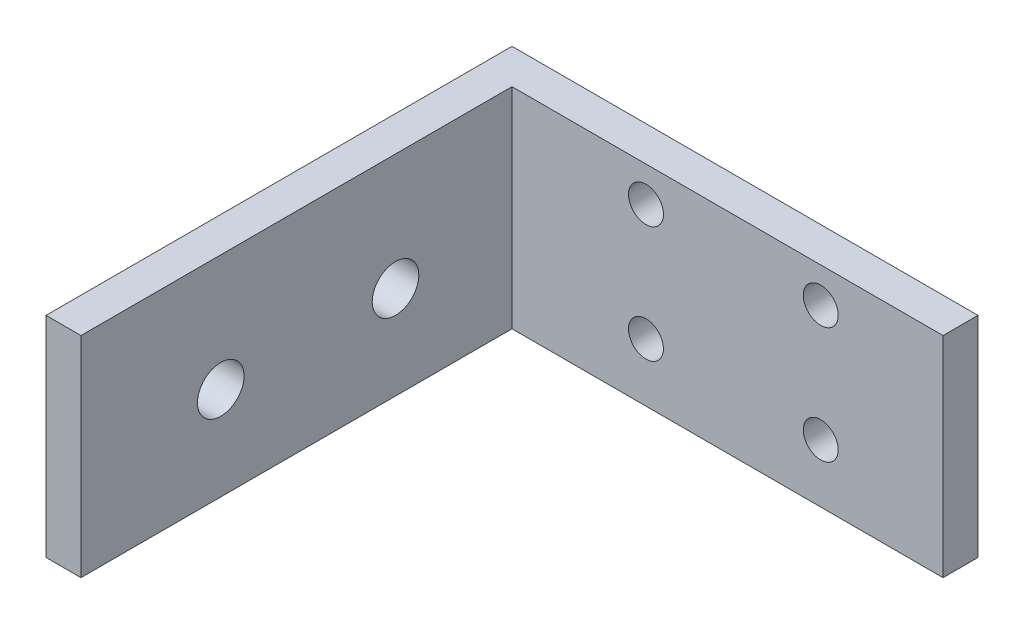
ISO-10303-21;
HEADER;
FILE_DESCRIPTION(('STEP AP214'),'2;1');
FILE_NAME('part.step','',(''),(''),'','','');
FILE_SCHEMA(('AUTOMOTIVE_DESIGN { 1 0 10303 214 1 1 1 1 }'));
ENDSEC;
DATA;
#1=APPLICATION_CONTEXT('core data for automotive mechanical design processes');
#2=APPLICATION_PROTOCOL_DEFINITION('international standard','automotive_design',2000,#1);
#3=PRODUCT_CONTEXT('',#1,'mechanical');
#4=PRODUCT('Part','Part','',(#3));
#5=PRODUCT_RELATED_PRODUCT_CATEGORY('part','',(#4));
#6=PRODUCT_DEFINITION_FORMATION('','',#4);
#7=PRODUCT_DEFINITION_CONTEXT('part definition',#1,'design');
#8=PRODUCT_DEFINITION('design','',#6,#7);
#9=PRODUCT_DEFINITION_SHAPE('','',#8);
#10=(LENGTH_UNIT() NAMED_UNIT(*) SI_UNIT(.MILLI.,.METRE.));
#11=(NAMED_UNIT(*) PLANE_ANGLE_UNIT() SI_UNIT($,.RADIAN.));
#12=(NAMED_UNIT(*) SI_UNIT($,.STERADIAN.) SOLID_ANGLE_UNIT());
#13=UNCERTAINTY_MEASURE_WITH_UNIT(LENGTH_MEASURE(1.E-05),#10,'distance_accuracy_value','');
#14=(GEOMETRIC_REPRESENTATION_CONTEXT(3) GLOBAL_UNCERTAINTY_ASSIGNED_CONTEXT((#13)) GLOBAL_UNIT_ASSIGNED_CONTEXT((#10,
#11,#12)) REPRESENTATION_CONTEXT('',''));
#15=CARTESIAN_POINT('',(0.,0.,0.));
#16=DIRECTION('',(0.,0.,1.));
#17=DIRECTION('',(1.,0.,0.));
#18=AXIS2_PLACEMENT_3D('',#15,#16,#17);
#19=CARTESIAN_POINT('',(0.,0.,3.));
#20=DIRECTION('',(0.,0.,-1.));
#21=DIRECTION('',(-1.,0.,0.));
#22=AXIS2_PLACEMENT_3D('',#19,#20,#21);
#23=PLANE('',#22);
#24=CARTESIAN_POINT('',(29.5,15.,3.));
#25=DIRECTION('',(0.,0.,1.));
#26=DIRECTION('',(1.,0.,0.));
#27=AXIS2_PLACEMENT_3D('',#24,#25,#26);
#28=CIRCLE('',#27,1.5);
#29=CARTESIAN_POINT('',(31.,15.,3.));
#30=VERTEX_POINT('',#29);
#31=EDGE_CURVE('E302',#30,#30,#28,.T.);
#32=ORIENTED_EDGE('',*,*,#31,.F.);
#33=EDGE_LOOP('',(#32));
#34=FACE_BOUND('',#33,.T.);
#35=CARTESIAN_POINT('',(14.5,5.,3.));
#36=DIRECTION('',(0.,0.,1.));
#37=DIRECTION('',(1.,0.,0.));
#38=AXIS2_PLACEMENT_3D('',#35,#36,#37);
#39=CIRCLE('',#38,1.5);
#40=CARTESIAN_POINT('',(16.,5.,3.));
#41=VERTEX_POINT('',#40);
#42=EDGE_CURVE('E308',#41,#41,#39,.T.);
#43=ORIENTED_EDGE('',*,*,#42,.F.);
#44=EDGE_LOOP('',(#43));
#45=FACE_BOUND('',#44,.T.);
#46=CARTESIAN_POINT('',(29.5,5.,3.));
#47=DIRECTION('',(0.,0.,1.));
#48=DIRECTION('',(1.,0.,0.));
#49=AXIS2_PLACEMENT_3D('',#46,#47,#48);
#50=CIRCLE('',#49,1.5);
#51=CARTESIAN_POINT('',(31.,5.,3.));
#52=VERTEX_POINT('',#51);
#53=EDGE_CURVE('E295',#52,#52,#50,.T.);
#54=ORIENTED_EDGE('',*,*,#53,.F.);
#55=EDGE_LOOP('',(#54));
#56=FACE_BOUND('',#55,.T.);
#57=CARTESIAN_POINT('',(14.5,15.,3.));
#58=DIRECTION('',(0.,0.,1.));
#59=DIRECTION('',(1.,0.,0.));
#60=AXIS2_PLACEMENT_3D('',#57,#58,#59);
#61=CIRCLE('',#60,1.5);
#62=CARTESIAN_POINT('',(16.,15.,3.));
#63=VERTEX_POINT('',#62);
#64=EDGE_CURVE('E301',#63,#63,#61,.T.);
#65=ORIENTED_EDGE('',*,*,#64,.F.);
#66=EDGE_LOOP('',(#65));
#67=FACE_BOUND('',#66,.T.);
#68=DIRECTION('',(0.,1.,0.));
#69=VECTOR('',#68,1.);
#70=CARTESIAN_POINT('',(3.,18.,3.));
#71=LINE('',#70,#69);
#72=CARTESIAN_POINT('',(3.,0.,3.));
#73=VERTEX_POINT('',#72);
#74=CARTESIAN_POINT('',(3.,18.,3.));
#75=VERTEX_POINT('',#74);
#76=EDGE_CURVE('E48',#73,#75,#71,.T.);
#77=ORIENTED_EDGE('',*,*,#76,.F.);
#78=DIRECTION('',(1.,0.,0.));
#79=VECTOR('',#78,1.);
#80=CARTESIAN_POINT('',(0.,0.,3.));
#81=LINE('',#80,#79);
#82=CARTESIAN_POINT('',(40.,0.,3.));
#83=VERTEX_POINT('',#82);
#84=EDGE_CURVE('E85',#73,#83,#81,.T.);
#85=ORIENTED_EDGE('',*,*,#84,.T.);
#86=DIRECTION('',(0.,1.,0.));
#87=VECTOR('',#86,1.);
#88=CARTESIAN_POINT('',(40.,0.,3.));
#89=LINE('',#88,#87);
#90=CARTESIAN_POINT('',(40.,18.,3.));
#91=VERTEX_POINT('',#90);
#92=EDGE_CURVE('E54',#83,#91,#89,.T.);
#93=ORIENTED_EDGE('',*,*,#92,.T.);
#94=DIRECTION('',(-1.,0.,0.));
#95=VECTOR('',#94,1.);
#96=CARTESIAN_POINT('',(0.,18.,3.));
#97=LINE('',#96,#95);
#98=EDGE_CURVE('E95',#91,#75,#97,.T.);
#99=ORIENTED_EDGE('',*,*,#98,.T.);
#100=EDGE_LOOP('',(#77,#85,#93,#99));
#101=FACE_BOUND('',#100,.T.);
#102=ADVANCED_FACE('F33',(#34,#45,#56,#67,#101),#23,.F.);
#103=CARTESIAN_POINT('',(0.,0.,3.));
#104=DIRECTION('',(1.,0.,0.));
#105=DIRECTION('',(0.,0.,-1.));
#106=AXIS2_PLACEMENT_3D('',#103,#104,#105);
#107=PLANE('',#106);
#108=CARTESIAN_POINT('',(0.,8.,13.));
#109=DIRECTION('',(1.,0.,0.));
#110=DIRECTION('',(0.,1.,0.));
#111=AXIS2_PLACEMENT_3D('',#108,#109,#110);
#112=CIRCLE('',#111,2.);
#113=CARTESIAN_POINT('',(0.,10.,13.));
#114=VERTEX_POINT('',#113);
#115=EDGE_CURVE('E284',#114,#114,#112,.T.);
#116=ORIENTED_EDGE('',*,*,#115,.T.);
#117=EDGE_LOOP('',(#116));
#118=FACE_BOUND('',#117,.T.);
#119=CARTESIAN_POINT('',(0.,8.,28.));
#120=DIRECTION('',(1.,0.,0.));
#121=DIRECTION('',(0.,1.,0.));
#122=AXIS2_PLACEMENT_3D('',#119,#120,#121);
#123=CIRCLE('',#122,2.);
#124=CARTESIAN_POINT('',(0.,10.,28.));
#125=VERTEX_POINT('',#124);
#126=EDGE_CURVE('E292',#125,#125,#123,.T.);
#127=ORIENTED_EDGE('',*,*,#126,.T.);
#128=EDGE_LOOP('',(#127));
#129=FACE_BOUND('',#128,.T.);
#130=DIRECTION('',(0.,-1.,0.));
#131=VECTOR('',#130,1.);
#132=CARTESIAN_POINT('',(0.,0.,0.));
#133=LINE('',#132,#131);
#134=CARTESIAN_POINT('',(0.,18.,0.));
#135=VERTEX_POINT('',#134);
#136=CARTESIAN_POINT('',(0.,0.,0.));
#137=VERTEX_POINT('',#136);
#138=EDGE_CURVE('E92',#135,#137,#133,.T.);
#139=ORIENTED_EDGE('',*,*,#138,.T.);
#140=DIRECTION('',(0.,0.,-1.));
#141=VECTOR('',#140,1.);
#142=CARTESIAN_POINT('',(0.,0.,3.));
#143=LINE('',#142,#141);
#144=CARTESIAN_POINT('',(0.,0.,40.));
#145=VERTEX_POINT('',#144);
#146=EDGE_CURVE('E11',#145,#137,#143,.T.);
#147=ORIENTED_EDGE('',*,*,#146,.F.);
#148=DIRECTION('',(0.,-1.,0.));
#149=VECTOR('',#148,1.);
#150=CARTESIAN_POINT('',(0.,18.,40.));
#151=LINE('',#150,#149);
#152=CARTESIAN_POINT('',(0.,18.,40.));
#153=VERTEX_POINT('',#152);
#154=EDGE_CURVE('E94',#153,#145,#151,.T.);
#155=ORIENTED_EDGE('',*,*,#154,.F.);
#156=DIRECTION('',(0.,0.,-1.));
#157=VECTOR('',#156,1.);
#158=CARTESIAN_POINT('',(0.,18.,3.));
#159=LINE('',#158,#157);
#160=EDGE_CURVE('E78',#153,#135,#159,.T.);
#161=ORIENTED_EDGE('',*,*,#160,.T.);
#162=EDGE_LOOP('',(#139,#147,#155,#161));
#163=FACE_BOUND('',#162,.T.);
#164=ADVANCED_FACE('F35',(#118,#129,#163),#107,.F.);
#165=CARTESIAN_POINT('',(0.,0.,3.));
#166=DIRECTION('',(0.,1.,0.));
#167=DIRECTION('',(0.,0.,1.));
#168=AXIS2_PLACEMENT_3D('',#165,#166,#167);
#169=PLANE('',#168);
#170=DIRECTION('',(1.,0.,0.));
#171=VECTOR('',#170,1.);
#172=CARTESIAN_POINT('',(0.,0.,0.));
#173=LINE('',#172,#171);
#174=CARTESIAN_POINT('',(40.,0.,0.));
#175=VERTEX_POINT('',#174);
#176=EDGE_CURVE('E98',#137,#175,#173,.T.);
#177=ORIENTED_EDGE('',*,*,#176,.T.);
#178=DIRECTION('',(0.,0.,-1.));
#179=VECTOR('',#178,1.);
#180=CARTESIAN_POINT('',(40.,0.,3.));
#181=LINE('',#180,#179);
#182=EDGE_CURVE('E41',#83,#175,#181,.T.);
#183=ORIENTED_EDGE('',*,*,#182,.F.);
#184=ORIENTED_EDGE('',*,*,#84,.F.);
#185=DIRECTION('',(0.,0.,-1.));
#186=VECTOR('',#185,1.);
#187=CARTESIAN_POINT('',(3.,0.,40.));
#188=LINE('',#187,#186);
#189=CARTESIAN_POINT('',(3.,0.,40.));
#190=VERTEX_POINT('',#189);
#191=EDGE_CURVE('E99',#190,#73,#188,.T.);
#192=ORIENTED_EDGE('',*,*,#191,.F.);
#193=DIRECTION('',(1.,0.,0.));
#194=VECTOR('',#193,1.);
#195=CARTESIAN_POINT('',(0.,0.,40.));
#196=LINE('',#195,#194);
#197=EDGE_CURVE('E119',#145,#190,#196,.T.);
#198=ORIENTED_EDGE('',*,*,#197,.F.);
#199=ORIENTED_EDGE('',*,*,#146,.T.);
#200=EDGE_LOOP('',(#177,#183,#184,#192,#198,#199));
#201=FACE_BOUND('',#200,.T.);
#202=ADVANCED_FACE('F114',(#201),#169,.F.);
#203=CARTESIAN_POINT('',(40.,0.,3.));
#204=DIRECTION('',(-1.,0.,0.));
#205=DIRECTION('',(0.,0.,1.));
#206=AXIS2_PLACEMENT_3D('',#203,#204,#205);
#207=PLANE('',#206);
#208=DIRECTION('',(0.,1.,0.));
#209=VECTOR('',#208,1.);
#210=CARTESIAN_POINT('',(40.,0.,0.));
#211=LINE('',#210,#209);
#212=CARTESIAN_POINT('',(40.,18.,0.));
#213=VERTEX_POINT('',#212);
#214=EDGE_CURVE('E86',#175,#213,#211,.T.);
#215=ORIENTED_EDGE('',*,*,#214,.T.);
#216=DIRECTION('',(0.,0.,-1.));
#217=VECTOR('',#216,1.);
#218=CARTESIAN_POINT('',(40.,18.,3.));
#219=LINE('',#218,#217);
#220=EDGE_CURVE('E81',#91,#213,#219,.T.);
#221=ORIENTED_EDGE('',*,*,#220,.F.);
#222=ORIENTED_EDGE('',*,*,#92,.F.);
#223=ORIENTED_EDGE('',*,*,#182,.T.);
#224=EDGE_LOOP('',(#215,#221,#222,#223));
#225=FACE_BOUND('',#224,.T.);
#226=ADVANCED_FACE('F112',(#225),#207,.F.);
#227=CARTESIAN_POINT('',(0.,18.,3.));
#228=DIRECTION('',(0.,-1.,0.));
#229=DIRECTION('',(0.,0.,-1.));
#230=AXIS2_PLACEMENT_3D('',#227,#228,#229);
#231=PLANE('',#230);
#232=DIRECTION('',(-1.,0.,0.));
#233=VECTOR('',#232,1.);
#234=CARTESIAN_POINT('',(0.,18.,0.));
#235=LINE('',#234,#233);
#236=EDGE_CURVE('E74',#213,#135,#235,.T.);
#237=ORIENTED_EDGE('',*,*,#236,.T.);
#238=ORIENTED_EDGE('',*,*,#160,.F.);
#239=DIRECTION('',(-1.,0.,0.));
#240=VECTOR('',#239,1.);
#241=CARTESIAN_POINT('',(0.,18.,40.));
#242=LINE('',#241,#240);
#243=CARTESIAN_POINT('',(3.,18.,40.));
#244=VERTEX_POINT('',#243);
#245=EDGE_CURVE('E133',#244,#153,#242,.T.);
#246=ORIENTED_EDGE('',*,*,#245,.F.);
#247=DIRECTION('',(0.,0.,-1.));
#248=VECTOR('',#247,1.);
#249=CARTESIAN_POINT('',(3.,18.,40.));
#250=LINE('',#249,#248);
#251=EDGE_CURVE('E103',#244,#75,#250,.T.);
#252=ORIENTED_EDGE('',*,*,#251,.T.);
#253=ORIENTED_EDGE('',*,*,#98,.F.);
#254=ORIENTED_EDGE('',*,*,#220,.T.);
#255=EDGE_LOOP('',(#237,#238,#246,#252,#253,#254));
#256=FACE_BOUND('',#255,.T.);
#257=ADVANCED_FACE('F76',(#256),#231,.F.);
#258=CARTESIAN_POINT('',(0.,0.,0.));
#259=DIRECTION('',(0.,0.,-1.));
#260=DIRECTION('',(-1.,0.,0.));
#261=AXIS2_PLACEMENT_3D('',#258,#259,#260);
#262=PLANE('',#261);
#263=CARTESIAN_POINT('',(29.5,15.,0.));
#264=DIRECTION('',(0.,0.,1.));
#265=DIRECTION('',(1.,0.,0.));
#266=AXIS2_PLACEMENT_3D('',#263,#264,#265);
#267=CIRCLE('',#266,1.5);
#268=CARTESIAN_POINT('',(31.,15.,0.));
#269=VERTEX_POINT('',#268);
#270=EDGE_CURVE('E298',#269,#269,#267,.T.);
#271=ORIENTED_EDGE('',*,*,#270,.T.);
#272=EDGE_LOOP('',(#271));
#273=FACE_BOUND('',#272,.T.);
#274=CARTESIAN_POINT('',(14.5,5.,0.));
#275=DIRECTION('',(0.,0.,1.));
#276=DIRECTION('',(1.,0.,0.));
#277=AXIS2_PLACEMENT_3D('',#274,#275,#276);
#278=CIRCLE('',#277,1.5);
#279=CARTESIAN_POINT('',(16.,5.,0.));
#280=VERTEX_POINT('',#279);
#281=EDGE_CURVE('E305',#280,#280,#278,.T.);
#282=ORIENTED_EDGE('',*,*,#281,.T.);
#283=EDGE_LOOP('',(#282));
#284=FACE_BOUND('',#283,.T.);
#285=CARTESIAN_POINT('',(29.5,5.,0.));
#286=DIRECTION('',(0.,0.,1.));
#287=DIRECTION('',(1.,0.,0.));
#288=AXIS2_PLACEMENT_3D('',#285,#286,#287);
#289=CIRCLE('',#288,1.5);
#290=CARTESIAN_POINT('',(31.,5.,0.));
#291=VERTEX_POINT('',#290);
#292=EDGE_CURVE('E311',#291,#291,#289,.T.);
#293=ORIENTED_EDGE('',*,*,#292,.T.);
#294=EDGE_LOOP('',(#293));
#295=FACE_BOUND('',#294,.T.);
#296=CARTESIAN_POINT('',(14.5,15.,0.));
#297=DIRECTION('',(0.,0.,1.));
#298=DIRECTION('',(1.,0.,0.));
#299=AXIS2_PLACEMENT_3D('',#296,#297,#298);
#300=CIRCLE('',#299,1.5);
#301=CARTESIAN_POINT('',(16.,15.,0.));
#302=VERTEX_POINT('',#301);
#303=EDGE_CURVE('E142',#302,#302,#300,.T.);
#304=ORIENTED_EDGE('',*,*,#303,.T.);
#305=EDGE_LOOP('',(#304));
#306=FACE_BOUND('',#305,.T.);
#307=ORIENTED_EDGE('',*,*,#138,.F.);
#308=ORIENTED_EDGE('',*,*,#236,.F.);
#309=ORIENTED_EDGE('',*,*,#214,.F.);
#310=ORIENTED_EDGE('',*,*,#176,.F.);
#311=EDGE_LOOP('',(#307,#308,#309,#310));
#312=FACE_BOUND('',#311,.T.);
#313=ADVANCED_FACE('F97',(#273,#284,#295,#306,#312),#262,.T.);
#314=CARTESIAN_POINT('',(3.,18.,40.));
#315=DIRECTION('',(-1.,0.,0.));
#316=DIRECTION('',(0.,-1.,0.));
#317=AXIS2_PLACEMENT_3D('',#314,#315,#316);
#318=PLANE('',#317);
#319=CARTESIAN_POINT('',(3.,8.,13.));
#320=DIRECTION('',(1.,0.,0.));
#321=DIRECTION('',(0.,1.,0.));
#322=AXIS2_PLACEMENT_3D('',#319,#320,#321);
#323=CIRCLE('',#322,2.);
#324=CARTESIAN_POINT('',(3.,10.,13.));
#325=VERTEX_POINT('',#324);
#326=EDGE_CURVE('E287',#325,#325,#323,.T.);
#327=ORIENTED_EDGE('',*,*,#326,.F.);
#328=EDGE_LOOP('',(#327));
#329=FACE_BOUND('',#328,.T.);
#330=CARTESIAN_POINT('',(3.,8.,28.));
#331=DIRECTION('',(1.,0.,0.));
#332=DIRECTION('',(0.,1.,0.));
#333=AXIS2_PLACEMENT_3D('',#330,#331,#332);
#334=CIRCLE('',#333,2.);
#335=CARTESIAN_POINT('',(3.,10.,28.));
#336=VERTEX_POINT('',#335);
#337=EDGE_CURVE('E289',#336,#336,#334,.T.);
#338=ORIENTED_EDGE('',*,*,#337,.F.);
#339=EDGE_LOOP('',(#338));
#340=FACE_BOUND('',#339,.T.);
#341=ORIENTED_EDGE('',*,*,#76,.T.);
#342=ORIENTED_EDGE('',*,*,#251,.F.);
#343=DIRECTION('',(0.,1.,0.));
#344=VECTOR('',#343,1.);
#345=CARTESIAN_POINT('',(3.,18.,40.));
#346=LINE('',#345,#344);
#347=EDGE_CURVE('E130',#190,#244,#346,.T.);
#348=ORIENTED_EDGE('',*,*,#347,.F.);
#349=ORIENTED_EDGE('',*,*,#191,.T.);
#350=EDGE_LOOP('',(#341,#342,#348,#349));
#351=FACE_BOUND('',#350,.T.);
#352=ADVANCED_FACE('F137',(#329,#340,#351),#318,.F.);
#353=CARTESIAN_POINT('',(0.,0.,40.));
#354=DIRECTION('',(0.,0.,1.));
#355=DIRECTION('',(1.,0.,0.));
#356=AXIS2_PLACEMENT_3D('',#353,#354,#355);
#357=PLANE('',#356);
#358=ORIENTED_EDGE('',*,*,#154,.T.);
#359=ORIENTED_EDGE('',*,*,#197,.T.);
#360=ORIENTED_EDGE('',*,*,#347,.T.);
#361=ORIENTED_EDGE('',*,*,#245,.T.);
#362=EDGE_LOOP('',(#358,#359,#360,#361));
#363=FACE_BOUND('',#362,.T.);
#364=ADVANCED_FACE('F132',(#363),#357,.T.);
#365=CARTESIAN_POINT('',(14.5,15.,0.));
#366=DIRECTION('',(0.,0.,1.));
#367=DIRECTION('',(1.,0.,0.));
#368=AXIS2_PLACEMENT_3D('',#365,#366,#367);
#369=CYLINDRICAL_SURFACE('',#368,1.5);
#370=ORIENTED_EDGE('',*,*,#303,.F.);
#371=EDGE_LOOP('',(#370));
#372=FACE_BOUND('',#371,.T.);
#373=ORIENTED_EDGE('',*,*,#64,.T.);
#374=EDGE_LOOP('',(#373));
#375=FACE_BOUND('',#374,.T.);
#376=ADVANCED_FACE('F193',(#372,#375),#369,.F.);
#377=CARTESIAN_POINT('',(29.5,5.,0.));
#378=DIRECTION('',(0.,0.,1.));
#379=DIRECTION('',(1.,0.,0.));
#380=AXIS2_PLACEMENT_3D('',#377,#378,#379);
#381=CYLINDRICAL_SURFACE('',#380,1.5);
#382=ORIENTED_EDGE('',*,*,#292,.F.);
#383=EDGE_LOOP('',(#382));
#384=FACE_BOUND('',#383,.T.);
#385=ORIENTED_EDGE('',*,*,#53,.T.);
#386=EDGE_LOOP('',(#385));
#387=FACE_BOUND('',#386,.T.);
#388=ADVANCED_FACE('F198',(#384,#387),#381,.F.);
#389=CARTESIAN_POINT('',(14.5,5.,0.));
#390=DIRECTION('',(0.,0.,1.));
#391=DIRECTION('',(1.,0.,0.));
#392=AXIS2_PLACEMENT_3D('',#389,#390,#391);
#393=CYLINDRICAL_SURFACE('',#392,1.5);
#394=ORIENTED_EDGE('',*,*,#281,.F.);
#395=EDGE_LOOP('',(#394));
#396=FACE_BOUND('',#395,.T.);
#397=ORIENTED_EDGE('',*,*,#42,.T.);
#398=EDGE_LOOP('',(#397));
#399=FACE_BOUND('',#398,.T.);
#400=ADVANCED_FACE('F206',(#396,#399),#393,.F.);
#401=CARTESIAN_POINT('',(29.5,15.,0.));
#402=DIRECTION('',(0.,0.,1.));
#403=DIRECTION('',(1.,0.,0.));
#404=AXIS2_PLACEMENT_3D('',#401,#402,#403);
#405=CYLINDRICAL_SURFACE('',#404,1.5);
#406=ORIENTED_EDGE('',*,*,#270,.F.);
#407=EDGE_LOOP('',(#406));
#408=FACE_BOUND('',#407,.T.);
#409=ORIENTED_EDGE('',*,*,#31,.T.);
#410=EDGE_LOOP('',(#409));
#411=FACE_BOUND('',#410,.T.);
#412=ADVANCED_FACE('F214',(#408,#411),#405,.F.);
#413=CARTESIAN_POINT('',(0.,8.,28.));
#414=DIRECTION('',(1.,0.,0.));
#415=DIRECTION('',(0.,1.,0.));
#416=AXIS2_PLACEMENT_3D('',#413,#414,#415);
#417=CYLINDRICAL_SURFACE('',#416,2.);
#418=ORIENTED_EDGE('',*,*,#126,.F.);
#419=EDGE_LOOP('',(#418));
#420=FACE_BOUND('',#419,.T.);
#421=ORIENTED_EDGE('',*,*,#337,.T.);
#422=EDGE_LOOP('',(#421));
#423=FACE_BOUND('',#422,.T.);
#424=ADVANCED_FACE('F222',(#420,#423),#417,.F.);
#425=CARTESIAN_POINT('',(0.,8.,13.));
#426=DIRECTION('',(1.,0.,0.));
#427=DIRECTION('',(0.,1.,0.));
#428=AXIS2_PLACEMENT_3D('',#425,#426,#427);
#429=CYLINDRICAL_SURFACE('',#428,2.);
#430=ORIENTED_EDGE('',*,*,#115,.F.);
#431=EDGE_LOOP('',(#430));
#432=FACE_BOUND('',#431,.T.);
#433=ORIENTED_EDGE('',*,*,#326,.T.);
#434=EDGE_LOOP('',(#433));
#435=FACE_BOUND('',#434,.T.);
#436=ADVANCED_FACE('F229',(#432,#435),#429,.F.);
#437=CLOSED_SHELL('',(#102,#164,#202,#226,#257,#313,#352,#364,#376,#388,#400,#412,#424,#436));
#438=MANIFOLD_SOLID_BREP('B2',#437);
#439=ADVANCED_BREP_SHAPE_REPRESENTATION('',(#18,#438),#14);
#440=SHAPE_DEFINITION_REPRESENTATION(#9,#439);
ENDSEC;
END-ISO-10303-21;
